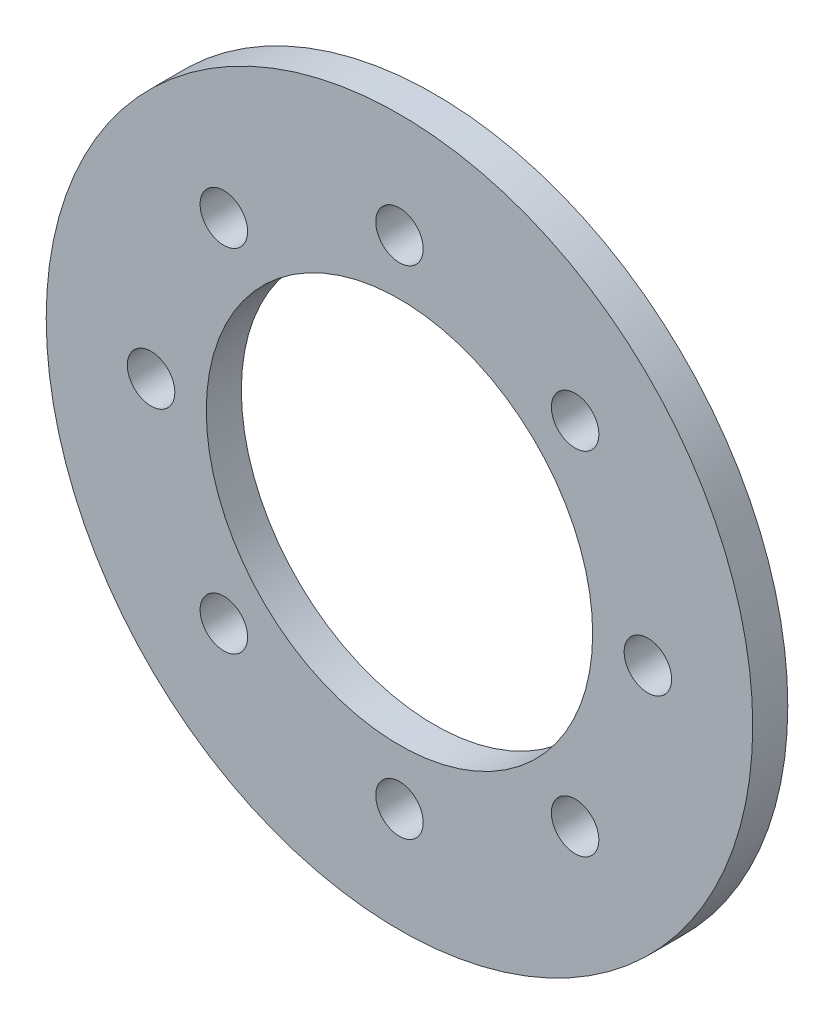
ISO-10303-21;
HEADER;
FILE_DESCRIPTION(('STEP AP214'),'2;1');
FILE_NAME('part.step','',(''),(''),'','','');
FILE_SCHEMA(('AUTOMOTIVE_DESIGN { 1 0 10303 214 1 1 1 1 }'));
ENDSEC;
DATA;
#1=APPLICATION_CONTEXT('core data for automotive mechanical design processes');
#2=APPLICATION_PROTOCOL_DEFINITION('international standard','automotive_design',2000,#1);
#3=PRODUCT_CONTEXT('',#1,'mechanical');
#4=PRODUCT('Part','Part','',(#3));
#5=PRODUCT_RELATED_PRODUCT_CATEGORY('part','',(#4));
#6=PRODUCT_DEFINITION_FORMATION('','',#4);
#7=PRODUCT_DEFINITION_CONTEXT('part definition',#1,'design');
#8=PRODUCT_DEFINITION('design','',#6,#7);
#9=PRODUCT_DEFINITION_SHAPE('','',#8);
#10=(LENGTH_UNIT() NAMED_UNIT(*) SI_UNIT(.MILLI.,.METRE.));
#11=(NAMED_UNIT(*) PLANE_ANGLE_UNIT() SI_UNIT($,.RADIAN.));
#12=(NAMED_UNIT(*) SI_UNIT($,.STERADIAN.) SOLID_ANGLE_UNIT());
#13=UNCERTAINTY_MEASURE_WITH_UNIT(LENGTH_MEASURE(1.E-05),#10,'distance_accuracy_value','');
#14=(GEOMETRIC_REPRESENTATION_CONTEXT(3) GLOBAL_UNCERTAINTY_ASSIGNED_CONTEXT((#13)) GLOBAL_UNIT_ASSIGNED_CONTEXT((#10,
#11,#12)) REPRESENTATION_CONTEXT('',''));
#15=CARTESIAN_POINT('',(0.,0.,0.));
#16=DIRECTION('',(0.,0.,1.));
#17=DIRECTION('',(1.,0.,0.));
#18=AXIS2_PLACEMENT_3D('',#15,#16,#17);
#19=CARTESIAN_POINT('',(0.,0.,1.5875));
#20=DIRECTION('',(0.,0.,1.));
#21=DIRECTION('',(1.,0.,0.));
#22=AXIS2_PLACEMENT_3D('',#19,#20,#21);
#23=PLANE('',#22);
#24=CARTESIAN_POINT('',(0.,-22.5,1.5875));
#25=DIRECTION('',(0.,0.,1.));
#26=DIRECTION('',(1.,0.,0.));
#27=AXIS2_PLACEMENT_3D('',#24,#25,#26);
#28=CIRCLE('',#27,2.15);
#29=CARTESIAN_POINT('',(2.15,-22.5,1.5875));
#30=VERTEX_POINT('',#29);
#31=EDGE_CURVE('E110',#30,#30,#28,.T.);
#32=ORIENTED_EDGE('',*,*,#31,.F.);
#33=EDGE_LOOP('',(#32));
#34=FACE_BOUND('',#33,.T.);
#35=CARTESIAN_POINT('',(22.5,0.,1.5875));
#36=DIRECTION('',(0.,0.,1.));
#37=DIRECTION('',(1.,0.,0.));
#38=AXIS2_PLACEMENT_3D('',#35,#36,#37);
#39=CIRCLE('',#38,2.15);
#40=CARTESIAN_POINT('',(24.65,0.,1.5875));
#41=VERTEX_POINT('',#40);
#42=EDGE_CURVE('E92',#41,#41,#39,.T.);
#43=ORIENTED_EDGE('',*,*,#42,.F.);
#44=EDGE_LOOP('',(#43));
#45=FACE_BOUND('',#44,.T.);
#46=CARTESIAN_POINT('',(0.,22.5,1.5875));
#47=DIRECTION('',(0.,0.,1.));
#48=DIRECTION('',(1.,0.,0.));
#49=AXIS2_PLACEMENT_3D('',#46,#47,#48);
#50=CIRCLE('',#49,2.15);
#51=CARTESIAN_POINT('',(2.15,22.5,1.5875));
#52=VERTEX_POINT('',#51);
#53=EDGE_CURVE('E76',#52,#52,#50,.T.);
#54=ORIENTED_EDGE('',*,*,#53,.F.);
#55=EDGE_LOOP('',(#54));
#56=FACE_BOUND('',#55,.T.);
#57=CARTESIAN_POINT('',(-22.5,0.,1.5875));
#58=DIRECTION('',(0.,0.,1.));
#59=DIRECTION('',(1.,0.,0.));
#60=AXIS2_PLACEMENT_3D('',#57,#58,#59);
#61=CIRCLE('',#60,2.15);
#62=CARTESIAN_POINT('',(-20.35,0.,1.5875));
#63=VERTEX_POINT('',#62);
#64=EDGE_CURVE('E62',#63,#63,#61,.T.);
#65=ORIENTED_EDGE('',*,*,#64,.F.);
#66=EDGE_LOOP('',(#65));
#67=FACE_BOUND('',#66,.T.);
#68=CARTESIAN_POINT('',(0.,0.,1.5875));
#69=DIRECTION('',(0.,0.,1.));
#70=DIRECTION('',(1.,0.,0.));
#71=AXIS2_PLACEMENT_3D('',#68,#69,#70);
#72=CIRCLE('',#71,32.);
#73=CARTESIAN_POINT('',(32.,0.,1.5875));
#74=VERTEX_POINT('',#73);
#75=EDGE_CURVE('E10',#74,#74,#72,.T.);
#76=ORIENTED_EDGE('',*,*,#75,.T.);
#77=EDGE_LOOP('',(#76));
#78=FACE_BOUND('',#77,.T.);
#79=CARTESIAN_POINT('',(0.,0.,1.5875));
#80=DIRECTION('',(0.,0.,1.));
#81=DIRECTION('',(1.,0.,0.));
#82=AXIS2_PLACEMENT_3D('',#79,#80,#81);
#83=CIRCLE('',#82,17.5);
#84=CARTESIAN_POINT('',(17.5,0.,1.5875));
#85=VERTEX_POINT('',#84);
#86=EDGE_CURVE('E57',#85,#85,#83,.T.);
#87=ORIENTED_EDGE('',*,*,#86,.F.);
#88=EDGE_LOOP('',(#87));
#89=FACE_BOUND('',#88,.T.);
#90=CARTESIAN_POINT('',(-15.9099025766973,15.9099025766973,1.5875));
#91=DIRECTION('',(0.,0.,1.));
#92=DIRECTION('',(1.,0.,0.));
#93=AXIS2_PLACEMENT_3D('',#90,#91,#92);
#94=CIRCLE('',#93,2.15);
#95=CARTESIAN_POINT('',(-13.7599025766973,15.9099025766973,1.5875));
#96=VERTEX_POINT('',#95);
#97=EDGE_CURVE('E68',#96,#96,#94,.T.);
#98=ORIENTED_EDGE('',*,*,#97,.F.);
#99=EDGE_LOOP('',(#98));
#100=FACE_BOUND('',#99,.T.);
#101=CARTESIAN_POINT('',(15.9099025766973,15.9099025766973,1.5875));
#102=DIRECTION('',(0.,0.,1.));
#103=DIRECTION('',(1.,0.,0.));
#104=AXIS2_PLACEMENT_3D('',#101,#102,#103);
#105=CIRCLE('',#104,2.15);
#106=CARTESIAN_POINT('',(18.0599025766973,15.9099025766973,1.5875));
#107=VERTEX_POINT('',#106);
#108=EDGE_CURVE('E86',#107,#107,#105,.T.);
#109=ORIENTED_EDGE('',*,*,#108,.F.);
#110=EDGE_LOOP('',(#109));
#111=FACE_BOUND('',#110,.T.);
#112=CARTESIAN_POINT('',(15.9099025766973,-15.9099025766973,1.5875));
#113=DIRECTION('',(0.,0.,1.));
#114=DIRECTION('',(1.,0.,0.));
#115=AXIS2_PLACEMENT_3D('',#112,#113,#114);
#116=CIRCLE('',#115,2.15);
#117=CARTESIAN_POINT('',(18.0599025766973,-15.9099025766973,1.5875));
#118=VERTEX_POINT('',#117);
#119=EDGE_CURVE('E105',#118,#118,#116,.T.);
#120=ORIENTED_EDGE('',*,*,#119,.F.);
#121=EDGE_LOOP('',(#120));
#122=FACE_BOUND('',#121,.T.);
#123=CARTESIAN_POINT('',(-15.9099025766973,-15.9099025766973,1.5875));
#124=DIRECTION('',(0.,0.,1.));
#125=DIRECTION('',(1.,0.,0.));
#126=AXIS2_PLACEMENT_3D('',#123,#124,#125);
#127=CIRCLE('',#126,2.15);
#128=CARTESIAN_POINT('',(-13.7599025766973,-15.9099025766973,1.5875));
#129=VERTEX_POINT('',#128);
#130=EDGE_CURVE('E119',#129,#129,#127,.T.);
#131=ORIENTED_EDGE('',*,*,#130,.F.);
#132=EDGE_LOOP('',(#131));
#133=FACE_BOUND('',#132,.T.);
#134=ADVANCED_FACE('F43',(#34,#45,#56,#67,#78,#89,#100,#111,#122,#133),#23,.T.);
#135=CARTESIAN_POINT('',(0.,0.,-1.5875));
#136=DIRECTION('',(0.,0.,1.));
#137=DIRECTION('',(1.,0.,0.));
#138=AXIS2_PLACEMENT_3D('',#135,#136,#137);
#139=PLANE('',#138);
#140=CARTESIAN_POINT('',(0.,0.,-1.5875));
#141=DIRECTION('',(0.,0.,1.));
#142=DIRECTION('',(1.,0.,0.));
#143=AXIS2_PLACEMENT_3D('',#140,#141,#142);
#144=CIRCLE('',#143,32.);
#145=CARTESIAN_POINT('',(32.,0.,-1.5875));
#146=VERTEX_POINT('',#145);
#147=EDGE_CURVE('E50',#146,#146,#144,.T.);
#148=ORIENTED_EDGE('',*,*,#147,.F.);
#149=EDGE_LOOP('',(#148));
#150=FACE_BOUND('',#149,.T.);
#151=CARTESIAN_POINT('',(0.,0.,-1.5875));
#152=DIRECTION('',(0.,0.,1.));
#153=DIRECTION('',(1.,0.,0.));
#154=AXIS2_PLACEMENT_3D('',#151,#152,#153);
#155=CIRCLE('',#154,17.5);
#156=CARTESIAN_POINT('',(17.5,0.,-1.5875));
#157=VERTEX_POINT('',#156);
#158=EDGE_CURVE('E59',#157,#157,#155,.T.);
#159=ORIENTED_EDGE('',*,*,#158,.T.);
#160=EDGE_LOOP('',(#159));
#161=FACE_BOUND('',#160,.T.);
#162=CARTESIAN_POINT('',(-22.5,0.,-1.5875));
#163=DIRECTION('',(0.,0.,1.));
#164=DIRECTION('',(1.,0.,0.));
#165=AXIS2_PLACEMENT_3D('',#162,#163,#164);
#166=CIRCLE('',#165,2.15);
#167=CARTESIAN_POINT('',(-20.35,0.,-1.5875));
#168=VERTEX_POINT('',#167);
#169=EDGE_CURVE('E67',#168,#168,#166,.T.);
#170=ORIENTED_EDGE('',*,*,#169,.T.);
#171=EDGE_LOOP('',(#170));
#172=FACE_BOUND('',#171,.T.);
#173=CARTESIAN_POINT('',(-15.9099025766973,15.9099025766973,-1.5875));
#174=DIRECTION('',(0.,0.,1.));
#175=DIRECTION('',(1.,0.,0.));
#176=AXIS2_PLACEMENT_3D('',#173,#174,#175);
#177=CIRCLE('',#176,2.15);
#178=CARTESIAN_POINT('',(-13.7599025766973,15.9099025766973,-1.5875));
#179=VERTEX_POINT('',#178);
#180=EDGE_CURVE('E73',#179,#179,#177,.T.);
#181=ORIENTED_EDGE('',*,*,#180,.T.);
#182=EDGE_LOOP('',(#181));
#183=FACE_BOUND('',#182,.T.);
#184=CARTESIAN_POINT('',(0.,22.5,-1.5875));
#185=DIRECTION('',(0.,0.,1.));
#186=DIRECTION('',(1.,0.,0.));
#187=AXIS2_PLACEMENT_3D('',#184,#185,#186);
#188=CIRCLE('',#187,2.15);
#189=CARTESIAN_POINT('',(2.15,22.5,-1.5875));
#190=VERTEX_POINT('',#189);
#191=EDGE_CURVE('E85',#190,#190,#188,.T.);
#192=ORIENTED_EDGE('',*,*,#191,.T.);
#193=EDGE_LOOP('',(#192));
#194=FACE_BOUND('',#193,.T.);
#195=CARTESIAN_POINT('',(15.9099025766973,15.9099025766973,-1.5875));
#196=DIRECTION('',(0.,0.,1.));
#197=DIRECTION('',(1.,0.,0.));
#198=AXIS2_PLACEMENT_3D('',#195,#196,#197);
#199=CIRCLE('',#198,2.15);
#200=CARTESIAN_POINT('',(18.0599025766973,15.9099025766973,-1.5875));
#201=VERTEX_POINT('',#200);
#202=EDGE_CURVE('E89',#201,#201,#199,.T.);
#203=ORIENTED_EDGE('',*,*,#202,.T.);
#204=EDGE_LOOP('',(#203));
#205=FACE_BOUND('',#204,.T.);
#206=CARTESIAN_POINT('',(22.5,0.,-1.5875));
#207=DIRECTION('',(0.,0.,1.));
#208=DIRECTION('',(1.,0.,0.));
#209=AXIS2_PLACEMENT_3D('',#206,#207,#208);
#210=CIRCLE('',#209,2.15);
#211=CARTESIAN_POINT('',(24.65,0.,-1.5875));
#212=VERTEX_POINT('',#211);
#213=EDGE_CURVE('E97',#212,#212,#210,.T.);
#214=ORIENTED_EDGE('',*,*,#213,.T.);
#215=EDGE_LOOP('',(#214));
#216=FACE_BOUND('',#215,.T.);
#217=CARTESIAN_POINT('',(15.9099025766973,-15.9099025766973,-1.5875));
#218=DIRECTION('',(0.,0.,1.));
#219=DIRECTION('',(1.,0.,0.));
#220=AXIS2_PLACEMENT_3D('',#217,#218,#219);
#221=CIRCLE('',#220,2.15);
#222=CARTESIAN_POINT('',(18.0599025766973,-15.9099025766973,-1.5875));
#223=VERTEX_POINT('',#222);
#224=EDGE_CURVE('E106',#223,#223,#221,.T.);
#225=ORIENTED_EDGE('',*,*,#224,.T.);
#226=EDGE_LOOP('',(#225));
#227=FACE_BOUND('',#226,.T.);
#228=CARTESIAN_POINT('',(0.,-22.5,-1.5875));
#229=DIRECTION('',(0.,0.,1.));
#230=DIRECTION('',(1.,0.,0.));
#231=AXIS2_PLACEMENT_3D('',#228,#229,#230);
#232=CIRCLE('',#231,2.15);
#233=CARTESIAN_POINT('',(2.15,-22.5,-1.5875));
#234=VERTEX_POINT('',#233);
#235=EDGE_CURVE('E114',#234,#234,#232,.T.);
#236=ORIENTED_EDGE('',*,*,#235,.T.);
#237=EDGE_LOOP('',(#236));
#238=FACE_BOUND('',#237,.T.);
#239=CARTESIAN_POINT('',(-15.9099025766973,-15.9099025766973,-1.5875));
#240=DIRECTION('',(0.,0.,1.));
#241=DIRECTION('',(1.,0.,0.));
#242=AXIS2_PLACEMENT_3D('',#239,#240,#241);
#243=CIRCLE('',#242,2.15);
#244=CARTESIAN_POINT('',(-13.7599025766973,-15.9099025766973,-1.5875));
#245=VERTEX_POINT('',#244);
#246=EDGE_CURVE('E122',#245,#245,#243,.T.);
#247=ORIENTED_EDGE('',*,*,#246,.T.);
#248=EDGE_LOOP('',(#247));
#249=FACE_BOUND('',#248,.T.);
#250=ADVANCED_FACE('F132',(#150,#161,#172,#183,#194,#205,#216,#227,#238,#249),#139,.F.);
#251=CARTESIAN_POINT('',(0.,0.,1.5875));
#252=DIRECTION('',(0.,0.,-1.));
#253=DIRECTION('',(-1.,0.,0.));
#254=AXIS2_PLACEMENT_3D('',#251,#252,#253);
#255=CYLINDRICAL_SURFACE('',#254,32.);
#256=ORIENTED_EDGE('',*,*,#75,.F.);
#257=EDGE_LOOP('',(#256));
#258=FACE_BOUND('',#257,.T.);
#259=ORIENTED_EDGE('',*,*,#147,.T.);
#260=EDGE_LOOP('',(#259));
#261=FACE_BOUND('',#260,.T.);
#262=ADVANCED_FACE('F44',(#258,#261),#255,.T.);
#263=CARTESIAN_POINT('',(0.,0.,1.5875));
#264=DIRECTION('',(0.,0.,-1.));
#265=DIRECTION('',(-1.,0.,0.));
#266=AXIS2_PLACEMENT_3D('',#263,#264,#265);
#267=CYLINDRICAL_SURFACE('',#266,17.5);
#268=ORIENTED_EDGE('',*,*,#86,.T.);
#269=EDGE_LOOP('',(#268));
#270=FACE_BOUND('',#269,.T.);
#271=ORIENTED_EDGE('',*,*,#158,.F.);
#272=EDGE_LOOP('',(#271));
#273=FACE_BOUND('',#272,.T.);
#274=ADVANCED_FACE('F143',(#270,#273),#267,.F.);
#275=CARTESIAN_POINT('',(-22.5,0.,1.5875));
#276=DIRECTION('',(0.,0.,-1.));
#277=DIRECTION('',(-1.,0.,0.));
#278=AXIS2_PLACEMENT_3D('',#275,#276,#277);
#279=CYLINDRICAL_SURFACE('',#278,2.15);
#280=ORIENTED_EDGE('',*,*,#64,.T.);
#281=EDGE_LOOP('',(#280));
#282=FACE_BOUND('',#281,.T.);
#283=ORIENTED_EDGE('',*,*,#169,.F.);
#284=EDGE_LOOP('',(#283));
#285=FACE_BOUND('',#284,.T.);
#286=ADVANCED_FACE('F150',(#282,#285),#279,.F.);
#287=CARTESIAN_POINT('',(-15.9099025766973,15.9099025766973,1.5875));
#288=DIRECTION('',(0.,0.,-1.));
#289=DIRECTION('',(-1.,0.,0.));
#290=AXIS2_PLACEMENT_3D('',#287,#288,#289);
#291=CYLINDRICAL_SURFACE('',#290,2.15);
#292=ORIENTED_EDGE('',*,*,#97,.T.);
#293=EDGE_LOOP('',(#292));
#294=FACE_BOUND('',#293,.T.);
#295=ORIENTED_EDGE('',*,*,#180,.F.);
#296=EDGE_LOOP('',(#295));
#297=FACE_BOUND('',#296,.T.);
#298=ADVANCED_FACE('F151',(#294,#297),#291,.F.);
#299=CARTESIAN_POINT('',(0.,22.5,1.5875));
#300=DIRECTION('',(0.,0.,-1.));
#301=DIRECTION('',(-1.,0.,0.));
#302=AXIS2_PLACEMENT_3D('',#299,#300,#301);
#303=CYLINDRICAL_SURFACE('',#302,2.15);
#304=ORIENTED_EDGE('',*,*,#53,.T.);
#305=EDGE_LOOP('',(#304));
#306=FACE_BOUND('',#305,.T.);
#307=ORIENTED_EDGE('',*,*,#191,.F.);
#308=EDGE_LOOP('',(#307));
#309=FACE_BOUND('',#308,.T.);
#310=ADVANCED_FACE('F155',(#306,#309),#303,.F.);
#311=CARTESIAN_POINT('',(15.9099025766973,15.9099025766973,1.5875));
#312=DIRECTION('',(0.,0.,-1.));
#313=DIRECTION('',(-1.,0.,0.));
#314=AXIS2_PLACEMENT_3D('',#311,#312,#313);
#315=CYLINDRICAL_SURFACE('',#314,2.15);
#316=ORIENTED_EDGE('',*,*,#108,.T.);
#317=EDGE_LOOP('',(#316));
#318=FACE_BOUND('',#317,.T.);
#319=ORIENTED_EDGE('',*,*,#202,.F.);
#320=EDGE_LOOP('',(#319));
#321=FACE_BOUND('',#320,.T.);
#322=ADVANCED_FACE('F159',(#318,#321),#315,.F.);
#323=CARTESIAN_POINT('',(22.5,0.,1.5875));
#324=DIRECTION('',(0.,0.,-1.));
#325=DIRECTION('',(-1.,0.,0.));
#326=AXIS2_PLACEMENT_3D('',#323,#324,#325);
#327=CYLINDRICAL_SURFACE('',#326,2.15);
#328=ORIENTED_EDGE('',*,*,#42,.T.);
#329=EDGE_LOOP('',(#328));
#330=FACE_BOUND('',#329,.T.);
#331=ORIENTED_EDGE('',*,*,#213,.F.);
#332=EDGE_LOOP('',(#331));
#333=FACE_BOUND('',#332,.T.);
#334=ADVANCED_FACE('F164',(#330,#333),#327,.F.);
#335=CARTESIAN_POINT('',(15.9099025766973,-15.9099025766973,1.5875));
#336=DIRECTION('',(0.,0.,-1.));
#337=DIRECTION('',(-1.,0.,0.));
#338=AXIS2_PLACEMENT_3D('',#335,#336,#337);
#339=CYLINDRICAL_SURFACE('',#338,2.15);
#340=ORIENTED_EDGE('',*,*,#119,.T.);
#341=EDGE_LOOP('',(#340));
#342=FACE_BOUND('',#341,.T.);
#343=ORIENTED_EDGE('',*,*,#224,.F.);
#344=EDGE_LOOP('',(#343));
#345=FACE_BOUND('',#344,.T.);
#346=ADVANCED_FACE('F167',(#342,#345),#339,.F.);
#347=CARTESIAN_POINT('',(0.,-22.5,1.5875));
#348=DIRECTION('',(0.,0.,-1.));
#349=DIRECTION('',(-1.,0.,0.));
#350=AXIS2_PLACEMENT_3D('',#347,#348,#349);
#351=CYLINDRICAL_SURFACE('',#350,2.15);
#352=ORIENTED_EDGE('',*,*,#31,.T.);
#353=EDGE_LOOP('',(#352));
#354=FACE_BOUND('',#353,.T.);
#355=ORIENTED_EDGE('',*,*,#235,.F.);
#356=EDGE_LOOP('',(#355));
#357=FACE_BOUND('',#356,.T.);
#358=ADVANCED_FACE('F173',(#354,#357),#351,.F.);
#359=CARTESIAN_POINT('',(-15.9099025766973,-15.9099025766973,1.5875));
#360=DIRECTION('',(0.,0.,-1.));
#361=DIRECTION('',(-1.,0.,0.));
#362=AXIS2_PLACEMENT_3D('',#359,#360,#361);
#363=CYLINDRICAL_SURFACE('',#362,2.15);
#364=ORIENTED_EDGE('',*,*,#130,.T.);
#365=EDGE_LOOP('',(#364));
#366=FACE_BOUND('',#365,.T.);
#367=ORIENTED_EDGE('',*,*,#246,.F.);
#368=EDGE_LOOP('',(#367));
#369=FACE_BOUND('',#368,.T.);
#370=ADVANCED_FACE('F127',(#366,#369),#363,.F.);
#371=CLOSED_SHELL('',(#134,#250,#262,#274,#286,#298,#310,#322,#334,#346,#358,#370));
#372=MANIFOLD_SOLID_BREP('B2',#371);
#373=ADVANCED_BREP_SHAPE_REPRESENTATION('',(#18,#372),#14);
#374=SHAPE_DEFINITION_REPRESENTATION(#9,#373);
ENDSEC;
END-ISO-10303-21;
